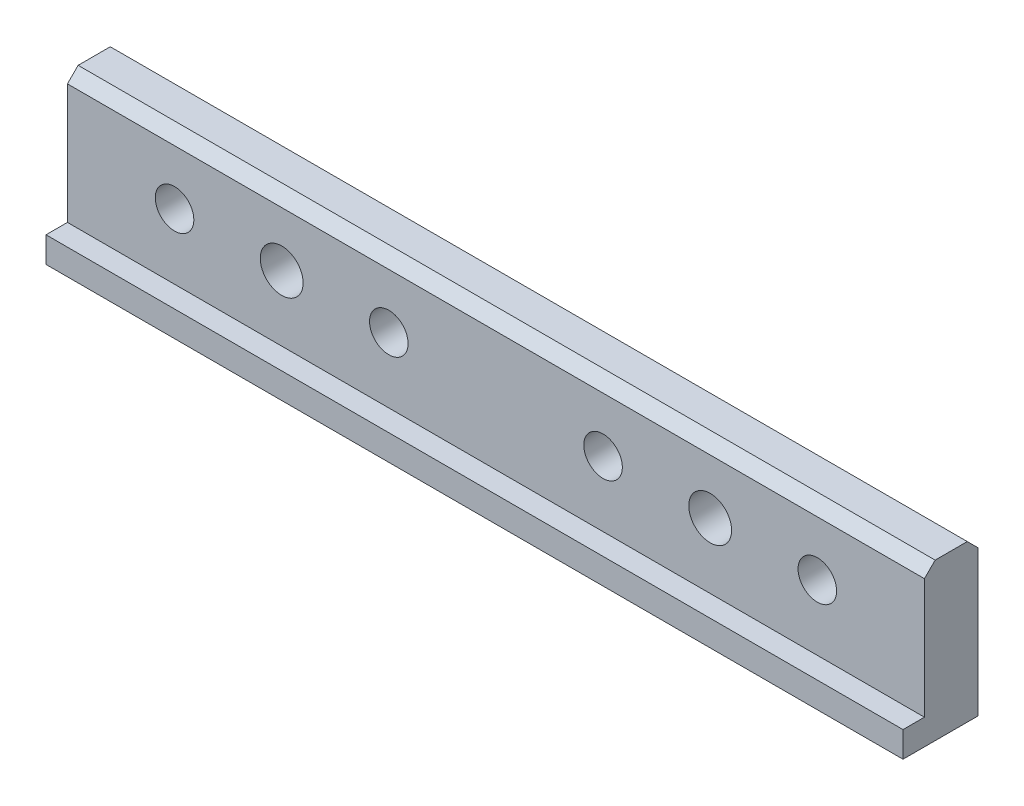
ISO-10303-21;
HEADER;
FILE_DESCRIPTION(('STEP AP214'),'2;1');
FILE_NAME('part.step','',(''),(''),'','','');
FILE_SCHEMA(('AUTOMOTIVE_DESIGN { 1 0 10303 214 1 1 1 1 }'));
ENDSEC;
DATA;
#1=APPLICATION_CONTEXT('core data for automotive mechanical design processes');
#2=APPLICATION_PROTOCOL_DEFINITION('international standard','automotive_design',2000,#1);
#3=PRODUCT_CONTEXT('',#1,'mechanical');
#4=PRODUCT('Part','Part','',(#3));
#5=PRODUCT_RELATED_PRODUCT_CATEGORY('part','',(#4));
#6=PRODUCT_DEFINITION_FORMATION('','',#4);
#7=PRODUCT_DEFINITION_CONTEXT('part definition',#1,'design');
#8=PRODUCT_DEFINITION('design','',#6,#7);
#9=PRODUCT_DEFINITION_SHAPE('','',#8);
#10=(LENGTH_UNIT() NAMED_UNIT(*) SI_UNIT(.MILLI.,.METRE.));
#11=(NAMED_UNIT(*) PLANE_ANGLE_UNIT() SI_UNIT($,.RADIAN.));
#12=(NAMED_UNIT(*) SI_UNIT($,.STERADIAN.) SOLID_ANGLE_UNIT());
#13=UNCERTAINTY_MEASURE_WITH_UNIT(LENGTH_MEASURE(1.E-05),#10,'distance_accuracy_value','');
#14=(GEOMETRIC_REPRESENTATION_CONTEXT(3) GLOBAL_UNCERTAINTY_ASSIGNED_CONTEXT((#13)) GLOBAL_UNIT_ASSIGNED_CONTEXT((#10,
#11,#12)) REPRESENTATION_CONTEXT('',''));
#15=CARTESIAN_POINT('',(0.,0.,0.));
#16=DIRECTION('',(0.,0.,1.));
#17=DIRECTION('',(1.,0.,0.));
#18=AXIS2_PLACEMENT_3D('',#15,#16,#17);
#19=CARTESIAN_POINT('',(-200.,40.,35.));
#20=DIRECTION('',(0.,-1.,0.));
#21=DIRECTION('',(0.,0.,-1.));
#22=AXIS2_PLACEMENT_3D('',#19,#20,#21);
#23=PLANE('',#22);
#24=DIRECTION('',(0.,0.,-1.));
#25=VECTOR('',#24,1.);
#26=CARTESIAN_POINT('',(200.,40.,35.));
#27=LINE('',#26,#25);
#28=CARTESIAN_POINT('',(200.,40.,19.9999999999999));
#29=VERTEX_POINT('',#28);
#30=CARTESIAN_POINT('',(200.,40.,4.99999999999995));
#31=VERTEX_POINT('',#30);
#32=EDGE_CURVE('E153',#29,#31,#27,.T.);
#33=ORIENTED_EDGE('',*,*,#32,.T.);
#34=DIRECTION('',(-1.,0.,0.));
#35=VECTOR('',#34,1.);
#36=CARTESIAN_POINT('',(-200.,40.,4.99999999999995));
#37=LINE('',#36,#35);
#38=CARTESIAN_POINT('',(-200.,40.,4.99999999999995));
#39=VERTEX_POINT('',#38);
#40=EDGE_CURVE('E158',#31,#39,#37,.T.);
#41=ORIENTED_EDGE('',*,*,#40,.T.);
#42=DIRECTION('',(0.,0.,-1.));
#43=VECTOR('',#42,1.);
#44=CARTESIAN_POINT('',(-200.,40.,35.));
#45=LINE('',#44,#43);
#46=CARTESIAN_POINT('',(-200.,40.,19.9999999999999));
#47=VERTEX_POINT('',#46);
#48=EDGE_CURVE('E148',#47,#39,#45,.T.);
#49=ORIENTED_EDGE('',*,*,#48,.F.);
#50=DIRECTION('',(1.,0.,0.));
#51=VECTOR('',#50,1.);
#52=CARTESIAN_POINT('',(200.,40.,19.9999999999999));
#53=LINE('',#52,#51);
#54=EDGE_CURVE('E156',#47,#29,#53,.T.);
#55=ORIENTED_EDGE('',*,*,#54,.T.);
#56=EDGE_LOOP('',(#33,#41,#49,#55));
#57=FACE_BOUND('',#56,.T.);
#58=ADVANCED_FACE('F35',(#57),#23,.F.);
#59=CARTESIAN_POINT('',(200.,40.,35.));
#60=DIRECTION('',(-1.,0.,0.));
#61=DIRECTION('',(0.,-1.,0.));
#62=AXIS2_PLACEMENT_3D('',#59,#60,#61);
#63=PLANE('',#62);
#64=DIRECTION('',(0.,1.,0.));
#65=VECTOR('',#64,1.);
#66=CARTESIAN_POINT('',(200.,40.,35.));
#67=LINE('',#66,#65);
#68=CARTESIAN_POINT('',(200.,-32.9979246179029,35.));
#69=VERTEX_POINT('',#68);
#70=CARTESIAN_POINT('',(200.,-21.,35.));
#71=VERTEX_POINT('',#70);
#72=EDGE_CURVE('E144',#69,#71,#67,.T.);
#73=ORIENTED_EDGE('',*,*,#72,.F.);
#74=DIRECTION('',(0.,0.,-1.));
#75=VECTOR('',#74,1.);
#76=CARTESIAN_POINT('',(200.,-32.9979246179029,35.));
#77=LINE('',#76,#75);
#78=CARTESIAN_POINT('',(200.,-32.9979246179029,0.));
#79=VERTEX_POINT('',#78);
#80=EDGE_CURVE('E193',#69,#79,#77,.T.);
#81=ORIENTED_EDGE('',*,*,#80,.T.);
#82=DIRECTION('',(0.,1.,0.));
#83=VECTOR('',#82,1.);
#84=CARTESIAN_POINT('',(200.,40.,0.));
#85=LINE('',#84,#83);
#86=CARTESIAN_POINT('',(200.,35.0000000000001,0.));
#87=VERTEX_POINT('',#86);
#88=EDGE_CURVE('E139',#79,#87,#85,.T.);
#89=ORIENTED_EDGE('',*,*,#88,.T.);
#90=DIRECTION('',(0.,-0.707106781186548,-0.707106781186548));
#91=VECTOR('',#90,1.);
#92=CARTESIAN_POINT('',(200.,39.9999999999999,4.99999999999988));
#93=LINE('',#92,#91);
#94=EDGE_CURVE('E170',#87,#31,#93,.F.);
#95=ORIENTED_EDGE('',*,*,#94,.T.);
#96=ORIENTED_EDGE('',*,*,#32,.F.);
#97=DIRECTION('',(0.,-0.707106781186544,0.707106781186551));
#98=VECTOR('',#97,1.);
#99=CARTESIAN_POINT('',(200.,35.,25.));
#100=LINE('',#99,#98);
#101=CARTESIAN_POINT('',(200.,35.,25.));
#102=VERTEX_POINT('',#101);
#103=EDGE_CURVE('E168',#29,#102,#100,.T.);
#104=ORIENTED_EDGE('',*,*,#103,.T.);
#105=DIRECTION('',(0.,1.,0.));
#106=VECTOR('',#105,1.);
#107=CARTESIAN_POINT('',(200.,40.,25.));
#108=LINE('',#107,#106);
#109=CARTESIAN_POINT('',(200.,-21.,25.));
#110=VERTEX_POINT('',#109);
#111=EDGE_CURVE('E131',#110,#102,#108,.T.);
#112=ORIENTED_EDGE('',*,*,#111,.F.);
#113=DIRECTION('',(0.,0.,1.));
#114=VECTOR('',#113,1.);
#115=CARTESIAN_POINT('',(200.,-21.,25.));
#116=LINE('',#115,#114);
#117=EDGE_CURVE('E130',#110,#71,#116,.T.);
#118=ORIENTED_EDGE('',*,*,#117,.T.);
#119=EDGE_LOOP('',(#73,#81,#89,#95,#96,#104,#112,#118));
#120=FACE_BOUND('',#119,.T.);
#121=ADVANCED_FACE('F200',(#120),#63,.F.);
#122=CARTESIAN_POINT('',(-200.,40.,35.));
#123=DIRECTION('',(1.,0.,0.));
#124=DIRECTION('',(0.,1.,0.));
#125=AXIS2_PLACEMENT_3D('',#122,#123,#124);
#126=PLANE('',#125);
#127=DIRECTION('',(0.,-1.,0.));
#128=VECTOR('',#127,1.);
#129=CARTESIAN_POINT('',(-200.,40.,0.));
#130=LINE('',#129,#128);
#131=CARTESIAN_POINT('',(-200.,35.0000000000001,0.));
#132=VERTEX_POINT('',#131);
#133=CARTESIAN_POINT('',(-200.,-32.9979246179029,0.));
#134=VERTEX_POINT('',#133);
#135=EDGE_CURVE('E146',#132,#134,#130,.T.);
#136=ORIENTED_EDGE('',*,*,#135,.T.);
#137=DIRECTION('',(0.,0.,1.));
#138=VECTOR('',#137,1.);
#139=CARTESIAN_POINT('',(-200.,-32.9979246179029,35.));
#140=LINE('',#139,#138);
#141=CARTESIAN_POINT('',(-200.,-32.9979246179029,35.));
#142=VERTEX_POINT('',#141);
#143=EDGE_CURVE('E188',#134,#142,#140,.T.);
#144=ORIENTED_EDGE('',*,*,#143,.T.);
#145=DIRECTION('',(0.,-1.,0.));
#146=VECTOR('',#145,1.);
#147=CARTESIAN_POINT('',(-200.,40.,35.));
#148=LINE('',#147,#146);
#149=CARTESIAN_POINT('',(-200.,-21.,35.));
#150=VERTEX_POINT('',#149);
#151=EDGE_CURVE('E137',#150,#142,#148,.T.);
#152=ORIENTED_EDGE('',*,*,#151,.F.);
#153=DIRECTION('',(0.,0.,1.));
#154=VECTOR('',#153,1.);
#155=CARTESIAN_POINT('',(-200.,-21.,25.));
#156=LINE('',#155,#154);
#157=CARTESIAN_POINT('',(-200.,-21.,25.));
#158=VERTEX_POINT('',#157);
#159=EDGE_CURVE('E127',#158,#150,#156,.T.);
#160=ORIENTED_EDGE('',*,*,#159,.F.);
#161=DIRECTION('',(0.,-1.,0.));
#162=VECTOR('',#161,1.);
#163=CARTESIAN_POINT('',(-200.,40.,25.));
#164=LINE('',#163,#162);
#165=CARTESIAN_POINT('',(-200.,35.,25.));
#166=VERTEX_POINT('',#165);
#167=EDGE_CURVE('E112',#166,#158,#164,.T.);
#168=ORIENTED_EDGE('',*,*,#167,.F.);
#169=DIRECTION('',(0.,0.707106781186544,-0.707106781186551));
#170=VECTOR('',#169,1.);
#171=CARTESIAN_POINT('',(-200.,35.,25.));
#172=LINE('',#171,#170);
#173=EDGE_CURVE('E161',#166,#47,#172,.T.);
#174=ORIENTED_EDGE('',*,*,#173,.T.);
#175=ORIENTED_EDGE('',*,*,#48,.T.);
#176=DIRECTION('',(0.,0.707106781186548,0.707106781186548));
#177=VECTOR('',#176,1.);
#178=CARTESIAN_POINT('',(-200.,40.,4.99999999999995));
#179=LINE('',#178,#177);
#180=EDGE_CURVE('E163',#39,#132,#179,.F.);
#181=ORIENTED_EDGE('',*,*,#180,.T.);
#182=EDGE_LOOP('',(#136,#144,#152,#160,#168,#174,#175,#181));
#183=FACE_BOUND('',#182,.T.);
#184=ADVANCED_FACE('F135',(#183),#126,.F.);
#185=CARTESIAN_POINT('',(-200.,-40.,35.));
#186=DIRECTION('',(0.,1.,0.));
#187=DIRECTION('',(0.,0.,1.));
#188=AXIS2_PLACEMENT_3D('',#185,#186,#187);
#189=PLANE('',#188);
#190=DIRECTION('',(1.,0.,0.));
#191=VECTOR('',#190,1.);
#192=CARTESIAN_POINT('',(-200.,-40.,10.0000000000001));
#193=LINE('',#192,#191);
#194=CARTESIAN_POINT('',(-190.,-40.,10.0000000000001));
#195=VERTEX_POINT('',#194);
#196=CARTESIAN_POINT('',(190.,-40.,10.0000000000001));
#197=VERTEX_POINT('',#196);
#198=EDGE_CURVE('E178',#195,#197,#193,.T.);
#199=ORIENTED_EDGE('',*,*,#198,.T.);
#200=DIRECTION('',(0.,0.,1.));
#201=VECTOR('',#200,1.);
#202=CARTESIAN_POINT('',(190.,-40.,35.));
#203=LINE('',#202,#201);
#204=CARTESIAN_POINT('',(190.,-40.,25.));
#205=VERTEX_POINT('',#204);
#206=EDGE_CURVE('E43',#197,#205,#203,.T.);
#207=ORIENTED_EDGE('',*,*,#206,.T.);
#208=DIRECTION('',(-1.,0.,0.));
#209=VECTOR('',#208,1.);
#210=CARTESIAN_POINT('',(-200.,-40.,25.));
#211=LINE('',#210,#209);
#212=CARTESIAN_POINT('',(-190.,-40.,25.));
#213=VERTEX_POINT('',#212);
#214=EDGE_CURVE('E176',#205,#213,#211,.T.);
#215=ORIENTED_EDGE('',*,*,#214,.T.);
#216=DIRECTION('',(0.,0.,-1.));
#217=VECTOR('',#216,1.);
#218=CARTESIAN_POINT('',(-190.,-40.,35.));
#219=LINE('',#218,#217);
#220=EDGE_CURVE('E183',#213,#195,#219,.T.);
#221=ORIENTED_EDGE('',*,*,#220,.T.);
#222=EDGE_LOOP('',(#199,#207,#215,#221));
#223=FACE_BOUND('',#222,.T.);
#224=ADVANCED_FACE('F214',(#223),#189,.F.);
#225=CARTESIAN_POINT('',(0.,0.,35.));
#226=DIRECTION('',(0.,0.,1.));
#227=DIRECTION('',(1.,0.,0.));
#228=AXIS2_PLACEMENT_3D('',#225,#226,#227);
#229=PLANE('',#228);
#230=ORIENTED_EDGE('',*,*,#151,.T.);
#231=DIRECTION('',(1.,0.,0.));
#232=VECTOR('',#231,1.);
#233=CARTESIAN_POINT('',(200.,-32.9979246179029,35.));
#234=LINE('',#233,#232);
#235=EDGE_CURVE('E173',#142,#69,#234,.T.);
#236=ORIENTED_EDGE('',*,*,#235,.T.);
#237=ORIENTED_EDGE('',*,*,#72,.T.);
#238=DIRECTION('',(1.,0.,0.));
#239=VECTOR('',#238,1.);
#240=CARTESIAN_POINT('',(-200.,-21.,35.));
#241=LINE('',#240,#239);
#242=EDGE_CURVE('E122',#150,#71,#241,.T.);
#243=ORIENTED_EDGE('',*,*,#242,.F.);
#244=EDGE_LOOP('',(#230,#236,#237,#243));
#245=FACE_BOUND('',#244,.T.);
#246=ADVANCED_FACE('F219',(#245),#229,.T.);
#247=CARTESIAN_POINT('',(0.,0.,0.));
#248=DIRECTION('',(0.,0.,1.));
#249=DIRECTION('',(1.,0.,0.));
#250=AXIS2_PLACEMENT_3D('',#247,#248,#249);
#251=PLANE('',#250);
#252=CARTESIAN_POINT('',(-100.,9.50000000000001,0.));
#253=DIRECTION('',(0.,0.,1.));
#254=DIRECTION('',(1.,0.,0.));
#255=AXIS2_PLACEMENT_3D('',#252,#253,#254);
#256=CIRCLE('',#255,9.99999999999999);
#257=CARTESIAN_POINT('',(-90.0000000000001,9.50000000000001,0.));
#258=VERTEX_POINT('',#257);
#259=EDGE_CURVE('E227',#258,#258,#256,.F.);
#260=ORIENTED_EDGE('',*,*,#259,.F.);
#261=EDGE_LOOP('',(#260));
#262=FACE_BOUND('',#261,.T.);
#263=CARTESIAN_POINT('',(-50.0000000000001,9.50000000000001,0.));
#264=DIRECTION('',(0.,0.,1.));
#265=DIRECTION('',(1.,0.,0.));
#266=AXIS2_PLACEMENT_3D('',#263,#264,#265);
#267=CIRCLE('',#266,9.);
#268=CARTESIAN_POINT('',(-41.0000000000001,9.50000000000001,0.));
#269=VERTEX_POINT('',#268);
#270=EDGE_CURVE('E247',#269,#269,#267,.F.);
#271=ORIENTED_EDGE('',*,*,#270,.F.);
#272=EDGE_LOOP('',(#271));
#273=FACE_BOUND('',#272,.T.);
#274=CARTESIAN_POINT('',(49.9999999999999,9.50000000000001,0.));
#275=DIRECTION('',(0.,0.,1.));
#276=DIRECTION('',(1.,0.,0.));
#277=AXIS2_PLACEMENT_3D('',#274,#275,#276);
#278=CIRCLE('',#277,9.);
#279=CARTESIAN_POINT('',(58.9999999999999,9.50000000000001,0.));
#280=VERTEX_POINT('',#279);
#281=EDGE_CURVE('E241',#280,#280,#278,.F.);
#282=ORIENTED_EDGE('',*,*,#281,.F.);
#283=EDGE_LOOP('',(#282));
#284=FACE_BOUND('',#283,.T.);
#285=CARTESIAN_POINT('',(99.9999999999999,9.50000000000001,0.));
#286=DIRECTION('',(0.,0.,1.));
#287=DIRECTION('',(1.,0.,0.));
#288=AXIS2_PLACEMENT_3D('',#285,#286,#287);
#289=CIRCLE('',#288,9.99999999999999);
#290=CARTESIAN_POINT('',(110.,9.50000000000001,0.));
#291=VERTEX_POINT('',#290);
#292=EDGE_CURVE('E235',#291,#291,#289,.F.);
#293=ORIENTED_EDGE('',*,*,#292,.F.);
#294=EDGE_LOOP('',(#293));
#295=FACE_BOUND('',#294,.T.);
#296=CARTESIAN_POINT('',(150.,9.50000000000001,0.));
#297=DIRECTION('',(0.,0.,1.));
#298=DIRECTION('',(1.,0.,0.));
#299=AXIS2_PLACEMENT_3D('',#296,#297,#298);
#300=CIRCLE('',#299,9.00000000000001);
#301=CARTESIAN_POINT('',(159.,9.50000000000001,0.));
#302=VERTEX_POINT('',#301);
#303=EDGE_CURVE('E228',#302,#302,#300,.F.);
#304=ORIENTED_EDGE('',*,*,#303,.F.);
#305=EDGE_LOOP('',(#304));
#306=FACE_BOUND('',#305,.T.);
#307=CARTESIAN_POINT('',(-150.,9.50000000000001,0.));
#308=DIRECTION('',(0.,0.,1.));
#309=DIRECTION('',(1.,0.,0.));
#310=AXIS2_PLACEMENT_3D('',#307,#308,#309);
#311=CIRCLE('',#310,9.00000000000001);
#312=CARTESIAN_POINT('',(-141.,9.50000000000001,0.));
#313=VERTEX_POINT('',#312);
#314=EDGE_CURVE('E220',#313,#313,#311,.F.);
#315=ORIENTED_EDGE('',*,*,#314,.F.);
#316=EDGE_LOOP('',(#315));
#317=FACE_BOUND('',#316,.T.);
#318=ORIENTED_EDGE('',*,*,#88,.F.);
#319=DIRECTION('',(-1.,0.,0.));
#320=VECTOR('',#319,1.);
#321=CARTESIAN_POINT('',(0.,-32.9979246179029,0.));
#322=LINE('',#321,#320);
#323=EDGE_CURVE('E180',#79,#134,#322,.T.);
#324=ORIENTED_EDGE('',*,*,#323,.T.);
#325=ORIENTED_EDGE('',*,*,#135,.F.);
#326=DIRECTION('',(1.,0.,0.));
#327=VECTOR('',#326,1.);
#328=CARTESIAN_POINT('',(0.,35.0000000000001,0.));
#329=LINE('',#328,#327);
#330=EDGE_CURVE('E165',#132,#87,#329,.T.);
#331=ORIENTED_EDGE('',*,*,#330,.T.);
#332=EDGE_LOOP('',(#318,#324,#325,#331));
#333=FACE_BOUND('',#332,.T.);
#334=ADVANCED_FACE('F204',(#262,#273,#284,#295,#306,#317,#333),#251,.F.);
#335=CARTESIAN_POINT('',(-200.,-21.,25.));
#336=DIRECTION('',(0.,-1.,0.));
#337=DIRECTION('',(1.,0.,0.));
#338=AXIS2_PLACEMENT_3D('',#335,#336,#337);
#339=PLANE('',#338);
#340=ORIENTED_EDGE('',*,*,#242,.T.);
#341=ORIENTED_EDGE('',*,*,#117,.F.);
#342=DIRECTION('',(1.,0.,0.));
#343=VECTOR('',#342,1.);
#344=CARTESIAN_POINT('',(-200.,-21.,25.));
#345=LINE('',#344,#343);
#346=EDGE_CURVE('E116',#158,#110,#345,.T.);
#347=ORIENTED_EDGE('',*,*,#346,.F.);
#348=ORIENTED_EDGE('',*,*,#159,.T.);
#349=EDGE_LOOP('',(#340,#341,#347,#348));
#350=FACE_BOUND('',#349,.T.);
#351=ADVANCED_FACE('F126',(#350),#339,.F.);
#352=CARTESIAN_POINT('',(0.,0.,25.));
#353=DIRECTION('',(0.,0.,1.));
#354=DIRECTION('',(1.,0.,0.));
#355=AXIS2_PLACEMENT_3D('',#352,#353,#354);
#356=PLANE('',#355);
#357=CARTESIAN_POINT('',(-100.,9.50000000000001,25.));
#358=DIRECTION('',(0.,0.,1.));
#359=DIRECTION('',(1.,0.,0.));
#360=AXIS2_PLACEMENT_3D('',#357,#358,#359);
#361=CIRCLE('',#360,9.99999999999999);
#362=CARTESIAN_POINT('',(-90.0000000000001,9.50000000000001,25.));
#363=VERTEX_POINT('',#362);
#364=EDGE_CURVE('E250',#363,#363,#361,.T.);
#365=ORIENTED_EDGE('',*,*,#364,.F.);
#366=EDGE_LOOP('',(#365));
#367=FACE_BOUND('',#366,.T.);
#368=CARTESIAN_POINT('',(-50.0000000000001,9.50000000000001,25.));
#369=DIRECTION('',(0.,0.,1.));
#370=DIRECTION('',(1.,0.,0.));
#371=AXIS2_PLACEMENT_3D('',#368,#369,#370);
#372=CIRCLE('',#371,9.);
#373=CARTESIAN_POINT('',(-41.0000000000001,9.50000000000001,25.));
#374=VERTEX_POINT('',#373);
#375=EDGE_CURVE('E244',#374,#374,#372,.T.);
#376=ORIENTED_EDGE('',*,*,#375,.F.);
#377=EDGE_LOOP('',(#376));
#378=FACE_BOUND('',#377,.T.);
#379=CARTESIAN_POINT('',(49.9999999999999,9.50000000000001,25.));
#380=DIRECTION('',(0.,0.,1.));
#381=DIRECTION('',(1.,0.,0.));
#382=AXIS2_PLACEMENT_3D('',#379,#380,#381);
#383=CIRCLE('',#382,9.);
#384=CARTESIAN_POINT('',(58.9999999999999,9.50000000000001,25.));
#385=VERTEX_POINT('',#384);
#386=EDGE_CURVE('E238',#385,#385,#383,.T.);
#387=ORIENTED_EDGE('',*,*,#386,.F.);
#388=EDGE_LOOP('',(#387));
#389=FACE_BOUND('',#388,.T.);
#390=CARTESIAN_POINT('',(99.9999999999999,9.50000000000001,25.));
#391=DIRECTION('',(0.,0.,1.));
#392=DIRECTION('',(1.,0.,0.));
#393=AXIS2_PLACEMENT_3D('',#390,#391,#392);
#394=CIRCLE('',#393,9.99999999999999);
#395=CARTESIAN_POINT('',(110.,9.50000000000001,25.));
#396=VERTEX_POINT('',#395);
#397=EDGE_CURVE('E231',#396,#396,#394,.T.);
#398=ORIENTED_EDGE('',*,*,#397,.F.);
#399=EDGE_LOOP('',(#398));
#400=FACE_BOUND('',#399,.T.);
#401=CARTESIAN_POINT('',(150.,9.50000000000001,25.));
#402=DIRECTION('',(0.,0.,1.));
#403=DIRECTION('',(1.,0.,0.));
#404=AXIS2_PLACEMENT_3D('',#401,#402,#403);
#405=CIRCLE('',#404,9.00000000000001);
#406=CARTESIAN_POINT('',(159.,9.50000000000001,25.));
#407=VERTEX_POINT('',#406);
#408=EDGE_CURVE('E232',#407,#407,#405,.T.);
#409=ORIENTED_EDGE('',*,*,#408,.F.);
#410=EDGE_LOOP('',(#409));
#411=FACE_BOUND('',#410,.T.);
#412=CARTESIAN_POINT('',(-150.,9.50000000000001,25.));
#413=DIRECTION('',(0.,0.,1.));
#414=DIRECTION('',(1.,0.,0.));
#415=AXIS2_PLACEMENT_3D('',#412,#413,#414);
#416=CIRCLE('',#415,9.00000000000001);
#417=CARTESIAN_POINT('',(-141.,9.50000000000001,25.));
#418=VERTEX_POINT('',#417);
#419=EDGE_CURVE('E222',#418,#418,#416,.T.);
#420=ORIENTED_EDGE('',*,*,#419,.F.);
#421=EDGE_LOOP('',(#420));
#422=FACE_BOUND('',#421,.T.);
#423=ORIENTED_EDGE('',*,*,#111,.T.);
#424=DIRECTION('',(-1.,0.,0.));
#425=VECTOR('',#424,1.);
#426=CARTESIAN_POINT('',(-200.,35.,25.));
#427=LINE('',#426,#425);
#428=EDGE_CURVE('E119',#102,#166,#427,.T.);
#429=ORIENTED_EDGE('',*,*,#428,.T.);
#430=ORIENTED_EDGE('',*,*,#167,.T.);
#431=ORIENTED_EDGE('',*,*,#346,.T.);
#432=EDGE_LOOP('',(#423,#429,#430,#431));
#433=FACE_BOUND('',#432,.T.);
#434=ADVANCED_FACE('F115',(#367,#378,#389,#400,#411,#422,#433),#356,.T.);
#435=CARTESIAN_POINT('',(-200.,40.,4.99999999999995));
#436=DIRECTION('',(0.,-0.707106781186547,0.707106781186547));
#437=DIRECTION('',(-1.,0.,0.));
#438=AXIS2_PLACEMENT_3D('',#435,#436,#437);
#439=PLANE('',#438);
#440=ORIENTED_EDGE('',*,*,#94,.F.);
#441=ORIENTED_EDGE('',*,*,#330,.F.);
#442=ORIENTED_EDGE('',*,*,#180,.F.);
#443=ORIENTED_EDGE('',*,*,#40,.F.);
#444=EDGE_LOOP('',(#440,#441,#442,#443));
#445=FACE_BOUND('',#444,.T.);
#446=ADVANCED_FACE('F263',(#445),#439,.F.);
#447=CARTESIAN_POINT('',(0.,35.,25.));
#448=DIRECTION('',(0.,0.707106781186551,0.707106781186543));
#449=DIRECTION('',(1.,0.,0.));
#450=AXIS2_PLACEMENT_3D('',#447,#448,#449);
#451=PLANE('',#450);
#452=ORIENTED_EDGE('',*,*,#103,.F.);
#453=ORIENTED_EDGE('',*,*,#54,.F.);
#454=ORIENTED_EDGE('',*,*,#173,.F.);
#455=ORIENTED_EDGE('',*,*,#428,.F.);
#456=EDGE_LOOP('',(#452,#453,#454,#455));
#457=FACE_BOUND('',#456,.T.);
#458=ADVANCED_FACE('F308',(#457),#451,.T.);
#459=CARTESIAN_POINT('',(0.,-32.9979246179029,35.));
#460=DIRECTION('',(0.,-0.819152044288994,0.573576436351043));
#461=DIRECTION('',(-1.,0.,0.));
#462=AXIS2_PLACEMENT_3D('',#459,#460,#461);
#463=PLANE('',#462);
#464=ORIENTED_EDGE('',*,*,#214,.F.);
#465=DIRECTION('',(-0.633687274224647,-0.443712606279653,-0.63368727422464));
#466=VECTOR('',#465,1.);
#467=CARTESIAN_POINT('',(119.688087697147,-89.2329310203964,-45.3119123028517));
#468=LINE('',#467,#466);
#469=EDGE_CURVE('E11',#205,#69,#468,.F.);
#470=ORIENTED_EDGE('',*,*,#469,.T.);
#471=ORIENTED_EDGE('',*,*,#235,.F.);
#472=DIRECTION('',(-0.633687274224642,0.443712606279655,0.633687274224644));
#473=VECTOR('',#472,1.);
#474=CARTESIAN_POINT('',(-119.688087697149,-89.2329310203963,-45.3119123028516));
#475=LINE('',#474,#473);
#476=EDGE_CURVE('E190',#142,#213,#475,.F.);
#477=ORIENTED_EDGE('',*,*,#476,.T.);
#478=EDGE_LOOP('',(#464,#470,#471,#477));
#479=FACE_BOUND('',#478,.T.);
#480=ADVANCED_FACE('F217',(#479),#463,.T.);
#481=CARTESIAN_POINT('',(-200.,-40.,10.0000000000001));
#482=DIRECTION('',(0.,0.819152044288994,0.573576436351042));
#483=DIRECTION('',(1.,0.,0.));
#484=AXIS2_PLACEMENT_3D('',#481,#482,#483);
#485=PLANE('',#484);
#486=ORIENTED_EDGE('',*,*,#323,.F.);
#487=DIRECTION('',(-0.633687274224647,-0.443712606279653,0.633687274224641));
#488=VECTOR('',#487,1.);
#489=CARTESIAN_POINT('',(33.3917710094373,-149.658262484862,166.608228990561));
#490=LINE('',#489,#488);
#491=EDGE_CURVE('E57',#79,#197,#490,.T.);
#492=ORIENTED_EDGE('',*,*,#491,.T.);
#493=ORIENTED_EDGE('',*,*,#198,.F.);
#494=DIRECTION('',(-0.633687274224642,0.443712606279655,-0.633687274224644));
#495=VECTOR('',#494,1.);
#496=CARTESIAN_POINT('',(-194.015595615143,-37.1882496798753,5.98440438485748));
#497=LINE('',#496,#495);
#498=EDGE_CURVE('E186',#195,#134,#497,.T.);
#499=ORIENTED_EDGE('',*,*,#498,.T.);
#500=EDGE_LOOP('',(#486,#492,#493,#499));
#501=FACE_BOUND('',#500,.T.);
#502=ADVANCED_FACE('F208',(#501),#485,.F.);
#503=CARTESIAN_POINT('',(-190.,-40.,35.));
#504=DIRECTION('',(0.573576436351044,0.819152044288994,0.));
#505=DIRECTION('',(0.,0.,-1.));
#506=AXIS2_PLACEMENT_3D('',#503,#504,#505);
#507=PLANE('',#506);
#508=ORIENTED_EDGE('',*,*,#476,.F.);
#509=ORIENTED_EDGE('',*,*,#143,.F.);
#510=ORIENTED_EDGE('',*,*,#498,.F.);
#511=ORIENTED_EDGE('',*,*,#220,.F.);
#512=EDGE_LOOP('',(#508,#509,#510,#511));
#513=FACE_BOUND('',#512,.T.);
#514=ADVANCED_FACE('F213',(#513),#507,.F.);
#515=CARTESIAN_POINT('',(200.,-32.9979246179029,35.));
#516=DIRECTION('',(-0.573576436351039,0.819152044288997,0.));
#517=DIRECTION('',(0.,0.,-1.));
#518=AXIS2_PLACEMENT_3D('',#515,#516,#517);
#519=PLANE('',#518);
#520=ORIENTED_EDGE('',*,*,#469,.F.);
#521=ORIENTED_EDGE('',*,*,#206,.F.);
#522=ORIENTED_EDGE('',*,*,#491,.F.);
#523=ORIENTED_EDGE('',*,*,#80,.F.);
#524=EDGE_LOOP('',(#520,#521,#522,#523));
#525=FACE_BOUND('',#524,.T.);
#526=ADVANCED_FACE('F37',(#525),#519,.F.);
#527=CARTESIAN_POINT('',(-150.,9.50000000000001,-0.001000000000001));
#528=DIRECTION('',(0.,0.,1.));
#529=DIRECTION('',(1.,0.,0.));
#530=AXIS2_PLACEMENT_3D('',#527,#528,#529);
#531=CYLINDRICAL_SURFACE('',#530,9.00000000000001);
#532=ORIENTED_EDGE('',*,*,#419,.T.);
#533=EDGE_LOOP('',(#532));
#534=FACE_BOUND('',#533,.T.);
#535=ORIENTED_EDGE('',*,*,#314,.T.);
#536=EDGE_LOOP('',(#535));
#537=FACE_BOUND('',#536,.T.);
#538=ADVANCED_FACE('F275',(#534,#537),#531,.F.);
#539=CARTESIAN_POINT('',(150.,9.50000000000001,-0.001000000000001));
#540=DIRECTION('',(0.,0.,1.));
#541=DIRECTION('',(1.,0.,0.));
#542=AXIS2_PLACEMENT_3D('',#539,#540,#541);
#543=CYLINDRICAL_SURFACE('',#542,9.00000000000001);
#544=ORIENTED_EDGE('',*,*,#408,.T.);
#545=EDGE_LOOP('',(#544));
#546=FACE_BOUND('',#545,.T.);
#547=ORIENTED_EDGE('',*,*,#303,.T.);
#548=EDGE_LOOP('',(#547));
#549=FACE_BOUND('',#548,.T.);
#550=ADVANCED_FACE('F278',(#546,#549),#543,.F.);
#551=CARTESIAN_POINT('',(99.9999999999999,9.50000000000001,-0.001000000000001));
#552=DIRECTION('',(0.,0.,1.));
#553=DIRECTION('',(1.,0.,0.));
#554=AXIS2_PLACEMENT_3D('',#551,#552,#553);
#555=CYLINDRICAL_SURFACE('',#554,9.99999999999999);
#556=ORIENTED_EDGE('',*,*,#397,.T.);
#557=EDGE_LOOP('',(#556));
#558=FACE_BOUND('',#557,.T.);
#559=ORIENTED_EDGE('',*,*,#292,.T.);
#560=EDGE_LOOP('',(#559));
#561=FACE_BOUND('',#560,.T.);
#562=ADVANCED_FACE('F332',(#558,#561),#555,.F.);
#563=CARTESIAN_POINT('',(49.9999999999999,9.50000000000001,-0.001000000000001));
#564=DIRECTION('',(0.,0.,1.));
#565=DIRECTION('',(1.,0.,0.));
#566=AXIS2_PLACEMENT_3D('',#563,#564,#565);
#567=CYLINDRICAL_SURFACE('',#566,9.);
#568=ORIENTED_EDGE('',*,*,#386,.T.);
#569=EDGE_LOOP('',(#568));
#570=FACE_BOUND('',#569,.T.);
#571=ORIENTED_EDGE('',*,*,#281,.T.);
#572=EDGE_LOOP('',(#571));
#573=FACE_BOUND('',#572,.T.);
#574=ADVANCED_FACE('F340',(#570,#573),#567,.F.);
#575=CARTESIAN_POINT('',(-50.0000000000001,9.50000000000001,-0.001000000000001));
#576=DIRECTION('',(0.,0.,1.));
#577=DIRECTION('',(1.,0.,0.));
#578=AXIS2_PLACEMENT_3D('',#575,#576,#577);
#579=CYLINDRICAL_SURFACE('',#578,9.);
#580=ORIENTED_EDGE('',*,*,#375,.T.);
#581=EDGE_LOOP('',(#580));
#582=FACE_BOUND('',#581,.T.);
#583=ORIENTED_EDGE('',*,*,#270,.T.);
#584=EDGE_LOOP('',(#583));
#585=FACE_BOUND('',#584,.T.);
#586=ADVANCED_FACE('F348',(#582,#585),#579,.F.);
#587=CARTESIAN_POINT('',(-100.,9.50000000000001,-0.001000000000001));
#588=DIRECTION('',(0.,0.,1.));
#589=DIRECTION('',(1.,0.,0.));
#590=AXIS2_PLACEMENT_3D('',#587,#588,#589);
#591=CYLINDRICAL_SURFACE('',#590,9.99999999999999);
#592=ORIENTED_EDGE('',*,*,#364,.T.);
#593=EDGE_LOOP('',(#592));
#594=FACE_BOUND('',#593,.T.);
#595=ORIENTED_EDGE('',*,*,#259,.T.);
#596=EDGE_LOOP('',(#595));
#597=FACE_BOUND('',#596,.T.);
#598=ADVANCED_FACE('F258',(#594,#597),#591,.F.);
#599=CLOSED_SHELL('',(#58,#121,#184,#224,#246,#334,#351,#434,#446,#458,#480,#502,#514,#526,#538,
#550,#562,#574,#586,#598));
#600=MANIFOLD_SOLID_BREP('B2',#599);
#601=ADVANCED_BREP_SHAPE_REPRESENTATION('',(#18,#600),#14);
#602=SHAPE_DEFINITION_REPRESENTATION(#9,#601);
ENDSEC;
END-ISO-10303-21;
